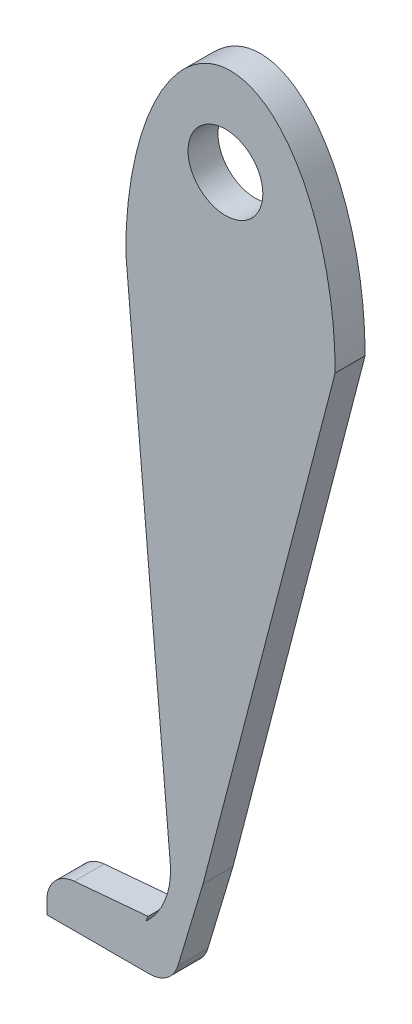
ISO-10303-21;
HEADER;
FILE_DESCRIPTION(('STEP AP214'),'2;1');
FILE_NAME('part.step','',(''),(''),'','','');
FILE_SCHEMA(('AUTOMOTIVE_DESIGN { 1 0 10303 214 1 1 1 1 }'));
ENDSEC;
DATA;
#1=APPLICATION_CONTEXT('core data for automotive mechanical design processes');
#2=APPLICATION_PROTOCOL_DEFINITION('international standard','automotive_design',2000,#1);
#3=PRODUCT_CONTEXT('',#1,'mechanical');
#4=PRODUCT('Part','Part','',(#3));
#5=PRODUCT_RELATED_PRODUCT_CATEGORY('part','',(#4));
#6=PRODUCT_DEFINITION_FORMATION('','',#4);
#7=PRODUCT_DEFINITION_CONTEXT('part definition',#1,'design');
#8=PRODUCT_DEFINITION('design','',#6,#7);
#9=PRODUCT_DEFINITION_SHAPE('','',#8);
#10=(LENGTH_UNIT() NAMED_UNIT(*) SI_UNIT(.MILLI.,.METRE.));
#11=(NAMED_UNIT(*) PLANE_ANGLE_UNIT() SI_UNIT($,.RADIAN.));
#12=(NAMED_UNIT(*) SI_UNIT($,.STERADIAN.) SOLID_ANGLE_UNIT());
#13=UNCERTAINTY_MEASURE_WITH_UNIT(LENGTH_MEASURE(1.E-05),#10,'distance_accuracy_value','');
#14=(GEOMETRIC_REPRESENTATION_CONTEXT(3) GLOBAL_UNCERTAINTY_ASSIGNED_CONTEXT((#13)) GLOBAL_UNIT_ASSIGNED_CONTEXT((#10,
#11,#12)) REPRESENTATION_CONTEXT('',''));
#15=CARTESIAN_POINT('',(0.,0.,0.));
#16=DIRECTION('',(0.,0.,1.));
#17=DIRECTION('',(1.,0.,0.));
#18=AXIS2_PLACEMENT_3D('',#15,#16,#17);
#19=CARTESIAN_POINT('',(-2.6062895464308,-7.,2.));
#20=DIRECTION('',(-0.957589152564701,0.288137145974652,0.));
#21=DIRECTION('',(-0.288137145974652,-0.957589152564701,0.));
#22=AXIS2_PLACEMENT_3D('',#19,#20,#21);
#23=PLANE('',#22);
#24=DIRECTION('',(0.288137145974652,0.957589152564701,0.));
#25=VECTOR('',#24,1.);
#26=CARTESIAN_POINT('',(-2.6062895464308,-7.,2.));
#27=LINE('',#26,#25);
#28=CARTESIAN_POINT('',(-2.17789260702337,-5.5762742919493,2.));
#29=VERTEX_POINT('',#28);
#30=CARTESIAN_POINT('',(-0.499999999999995,0.,2.));
#31=VERTEX_POINT('',#30);
#32=EDGE_CURVE('E154',#29,#31,#27,.T.);
#33=ORIENTED_EDGE('',*,*,#32,.F.);
#34=DIRECTION('',(0.,0.,-1.));
#35=VECTOR('',#34,1.);
#36=CARTESIAN_POINT('',(-2.17789260702337,-5.5762742919493,2.));
#37=LINE('',#36,#35);
#38=CARTESIAN_POINT('',(-2.17789260702337,-5.5762742919493,0.));
#39=VERTEX_POINT('',#38);
#40=EDGE_CURVE('E177',#29,#39,#37,.T.);
#41=ORIENTED_EDGE('',*,*,#40,.T.);
#42=DIRECTION('',(0.288137145974652,0.957589152564701,0.));
#43=VECTOR('',#42,1.);
#44=CARTESIAN_POINT('',(-2.6062895464308,-7.,0.));
#45=LINE('',#44,#43);
#46=CARTESIAN_POINT('',(-0.499999999999995,0.,0.));
#47=VERTEX_POINT('',#46);
#48=EDGE_CURVE('E197',#39,#47,#45,.T.);
#49=ORIENTED_EDGE('',*,*,#48,.T.);
#50=DIRECTION('',(0.,0.,-1.));
#51=VECTOR('',#50,1.);
#52=CARTESIAN_POINT('',(-0.499999999999995,0.,2.));
#53=LINE('',#52,#51);
#54=EDGE_CURVE('E165',#31,#47,#53,.T.);
#55=ORIENTED_EDGE('',*,*,#54,.F.);
#56=EDGE_LOOP('',(#33,#41,#49,#55));
#57=FACE_BOUND('',#56,.T.);
#58=ADVANCED_FACE('F34',(#57),#23,.F.);
#59=CARTESIAN_POINT('',(-0.499999999999995,0.,2.));
#60=DIRECTION('',(-0.96784691213223,0.251539966359438,0.));
#61=DIRECTION('',(-0.251539966359438,-0.96784691213223,0.));
#62=AXIS2_PLACEMENT_3D('',#59,#60,#61);
#63=PLANE('',#62);
#64=DIRECTION('',(0.251539966359438,0.96784691213223,0.));
#65=VECTOR('',#64,1.);
#66=CARTESIAN_POINT('',(-0.499999999999995,0.,0.));
#67=LINE('',#66,#65);
#68=CARTESIAN_POINT('',(8.33647894002109,34.,0.));
#69=VERTEX_POINT('',#68);
#70=EDGE_CURVE('E147',#47,#69,#67,.T.);
#71=ORIENTED_EDGE('',*,*,#70,.T.);
#72=DIRECTION('',(0.,0.,-1.));
#73=VECTOR('',#72,1.);
#74=CARTESIAN_POINT('',(8.33647894002109,34.,2.));
#75=LINE('',#74,#73);
#76=CARTESIAN_POINT('',(8.33647894002109,34.,2.));
#77=VERTEX_POINT('',#76);
#78=EDGE_CURVE('E162',#77,#69,#75,.T.);
#79=ORIENTED_EDGE('',*,*,#78,.F.);
#80=DIRECTION('',(0.251539966359438,0.96784691213223,0.));
#81=VECTOR('',#80,1.);
#82=CARTESIAN_POINT('',(-0.499999999999995,0.,2.));
#83=LINE('',#82,#81);
#84=EDGE_CURVE('E192',#31,#77,#83,.T.);
#85=ORIENTED_EDGE('',*,*,#84,.F.);
#86=ORIENTED_EDGE('',*,*,#54,.T.);
#87=EDGE_LOOP('',(#71,#79,#85,#86));
#88=FACE_BOUND('',#87,.T.);
#89=ADVANCED_FACE('F225',(#88),#63,.F.);
#90=CARTESIAN_POINT('',(1.33647894002109,34.,2.));
#91=DIRECTION('',(0.,0.,1.));
#92=DIRECTION('',(0.,1.,0.));
#93=AXIS2_PLACEMENT_3D('',#90,#91,#92);
#94=ELLIPSE('',#93,14.,7.);
#95=DIRECTION('',(0.,0.,-1.));
#96=VECTOR('',#95,1.);
#97=SURFACE_OF_LINEAR_EXTRUSION('',#94,#96);
#98=CARTESIAN_POINT('',(1.33647894002109,34.,0.));
#99=DIRECTION('',(0.,0.,1.));
#100=DIRECTION('',(0.,1.,0.));
#101=AXIS2_PLACEMENT_3D('',#98,#99,#100);
#102=ELLIPSE('',#101,14.,7.);
#103=CARTESIAN_POINT('',(-5.66352105997892,34.,0.));
#104=VERTEX_POINT('',#103);
#105=EDGE_CURVE('E142',#69,#104,#102,.T.);
#106=ORIENTED_EDGE('',*,*,#105,.T.);
#107=DIRECTION('',(0.,0.,-1.));
#108=VECTOR('',#107,1.);
#109=CARTESIAN_POINT('',(-5.66352105997892,34.,2.));
#110=LINE('',#109,#108);
#111=CARTESIAN_POINT('',(-5.66352105997892,34.,2.));
#112=VERTEX_POINT('',#111);
#113=EDGE_CURVE('E126',#112,#104,#110,.T.);
#114=ORIENTED_EDGE('',*,*,#113,.F.);
#115=EDGE_CURVE('E218',#77,#112,#94,.T.);
#116=ORIENTED_EDGE('',*,*,#115,.F.);
#117=ORIENTED_EDGE('',*,*,#78,.T.);
#118=EDGE_LOOP('',(#106,#114,#116,#117));
#119=FACE_BOUND('',#118,.T.);
#120=ADVANCED_FACE('F228',(#119),#97,.F.);
#121=CARTESIAN_POINT('',(-5.66352105997892,34.,2.));
#122=DIRECTION('',(0.99617267736109,0.0874070756817692,0.));
#123=DIRECTION('',(-0.0874070756817692,0.99617267736109,0.));
#124=AXIS2_PLACEMENT_3D('',#121,#122,#123);
#125=PLANE('',#124);
#126=DIRECTION('',(0.0874070756817692,-0.99617267736109,0.));
#127=VECTOR('',#126,1.);
#128=CARTESIAN_POINT('',(-5.66352105997892,34.,0.));
#129=LINE('',#128,#127);
#130=CARTESIAN_POINT('',(-2.68026259413472,0.,0.));
#131=VERTEX_POINT('',#130);
#132=EDGE_CURVE('E133',#104,#131,#129,.T.);
#133=ORIENTED_EDGE('',*,*,#132,.T.);
#134=DIRECTION('',(0.,0.,-1.));
#135=VECTOR('',#134,1.);
#136=CARTESIAN_POINT('',(-2.68026259413472,0.,2.));
#137=LINE('',#136,#135);
#138=CARTESIAN_POINT('',(-2.68026259413472,0.,2.));
#139=VERTEX_POINT('',#138);
#140=EDGE_CURVE('E118',#139,#131,#137,.T.);
#141=ORIENTED_EDGE('',*,*,#140,.F.);
#142=DIRECTION('',(0.0874070756817692,-0.99617267736109,0.));
#143=VECTOR('',#142,1.);
#144=CARTESIAN_POINT('',(-5.66352105997892,34.,2.));
#145=LINE('',#144,#143);
#146=EDGE_CURVE('E215',#112,#139,#145,.T.);
#147=ORIENTED_EDGE('',*,*,#146,.F.);
#148=ORIENTED_EDGE('',*,*,#113,.T.);
#149=EDGE_LOOP('',(#133,#141,#147,#148));
#150=FACE_BOUND('',#149,.T.);
#151=ADVANCED_FACE('F139',(#150),#125,.F.);
#152=CARTESIAN_POINT('',(-4.17189182705681,-3.70838700827068,2.));
#153=DIRECTION('',(0.0874070756817693,-0.996172677361089,0.));
#154=DIRECTION('',(0.99617267736109,0.0874070756817693,0.));
#155=AXIS2_PLACEMENT_3D('',#152,#153,#154);
#156=PLANE('',#155);
#157=DIRECTION('',(-0.99617267736109,-0.0874070756817693,0.));
#158=VECTOR('',#157,1.);
#159=CARTESIAN_POINT('',(-4.17189182705681,-3.70838700827068,0.));
#160=LINE('',#159,#158);
#161=CARTESIAN_POINT('',(-4.17189182705682,-3.70838700827069,0.));
#162=VERTEX_POINT('',#161);
#163=CARTESIAN_POINT('',(-9.11009276858463,-4.14167906017811,0.));
#164=VERTEX_POINT('',#163);
#165=EDGE_CURVE('E141',#162,#164,#160,.T.);
#166=ORIENTED_EDGE('',*,*,#165,.T.);
#167=DIRECTION('',(0.,0.,-1.));
#168=VECTOR('',#167,1.);
#169=CARTESIAN_POINT('',(-9.11009276858463,-4.14167906017811,2.));
#170=LINE('',#169,#168);
#171=CARTESIAN_POINT('',(-9.11009276858463,-4.14167906017811,2.));
#172=VERTEX_POINT('',#171);
#173=EDGE_CURVE('E173',#164,#172,#170,.F.);
#174=ORIENTED_EDGE('',*,*,#173,.T.);
#175=DIRECTION('',(-0.99617267736109,-0.0874070756817693,0.));
#176=VECTOR('',#175,1.);
#177=CARTESIAN_POINT('',(-4.17189182705681,-3.70838700827068,2.));
#178=LINE('',#177,#176);
#179=CARTESIAN_POINT('',(-4.17189182705682,-3.70838700827069,2.));
#180=VERTEX_POINT('',#179);
#181=EDGE_CURVE('E214',#180,#172,#178,.T.);
#182=ORIENTED_EDGE('',*,*,#181,.F.);
#183=DIRECTION('',(0.,0.,-1.));
#184=VECTOR('',#183,1.);
#185=CARTESIAN_POINT('',(-4.17189182705681,-3.70838700827068,2.));
#186=LINE('',#185,#184);
#187=EDGE_CURVE('E127',#180,#162,#186,.T.);
#188=ORIENTED_EDGE('',*,*,#187,.T.);
#189=EDGE_LOOP('',(#166,#174,#182,#188));
#190=FACE_BOUND('',#189,.T.);
#191=ADVANCED_FACE('F208',(#190),#156,.F.);
#192=CARTESIAN_POINT('',(-10.9352786172211,-4.30182615237469,2.));
#193=DIRECTION('',(1.,0.,0.));
#194=DIRECTION('',(0.,1.,0.));
#195=AXIS2_PLACEMENT_3D('',#192,#193,#194);
#196=PLANE('',#195);
#197=DIRECTION('',(0.,-1.,0.));
#198=VECTOR('',#197,1.);
#199=CARTESIAN_POINT('',(-10.9352786172211,-4.30182615237469,2.));
#200=LINE('',#199,#198);
#201=CARTESIAN_POINT('',(-10.9352786172211,-6.13402441490029,2.));
#202=VERTEX_POINT('',#201);
#203=CARTESIAN_POINT('',(-10.9352786172211,-7.,2.));
#204=VERTEX_POINT('',#203);
#205=EDGE_CURVE('E203',#202,#204,#200,.T.);
#206=ORIENTED_EDGE('',*,*,#205,.F.);
#207=DIRECTION('',(0.,0.,-1.));
#208=VECTOR('',#207,1.);
#209=CARTESIAN_POINT('',(-10.9352786172211,-6.13402441490029,2.));
#210=LINE('',#209,#208);
#211=CARTESIAN_POINT('',(-10.9352786172211,-6.13402441490029,0.));
#212=VERTEX_POINT('',#211);
#213=EDGE_CURVE('E168',#202,#212,#210,.T.);
#214=ORIENTED_EDGE('',*,*,#213,.T.);
#215=DIRECTION('',(0.,-1.,0.));
#216=VECTOR('',#215,1.);
#217=CARTESIAN_POINT('',(-10.9352786172211,-4.30182615237469,0.));
#218=LINE('',#217,#216);
#219=CARTESIAN_POINT('',(-10.9352786172211,-7.,0.));
#220=VERTEX_POINT('',#219);
#221=EDGE_CURVE('E145',#212,#220,#218,.T.);
#222=ORIENTED_EDGE('',*,*,#221,.T.);
#223=DIRECTION('',(0.,0.,-1.));
#224=VECTOR('',#223,1.);
#225=CARTESIAN_POINT('',(-10.9352786172211,-7.,2.));
#226=LINE('',#225,#224);
#227=EDGE_CURVE('E155',#204,#220,#226,.T.);
#228=ORIENTED_EDGE('',*,*,#227,.F.);
#229=EDGE_LOOP('',(#206,#214,#222,#228));
#230=FACE_BOUND('',#229,.T.);
#231=ADVANCED_FACE('F202',(#230),#196,.F.);
#232=CARTESIAN_POINT('',(-10.9352786172211,-7.,2.));
#233=DIRECTION('',(0.,1.,0.));
#234=DIRECTION('',(0.,0.,1.));
#235=AXIS2_PLACEMENT_3D('',#232,#233,#234);
#236=PLANE('',#235);
#237=DIRECTION('',(1.,0.,0.));
#238=VECTOR('',#237,1.);
#239=CARTESIAN_POINT('',(-10.9352786172211,-7.,0.));
#240=LINE('',#239,#238);
#241=CARTESIAN_POINT('',(-4.09307091215278,-7.,0.));
#242=VERTEX_POINT('',#241);
#243=EDGE_CURVE('E152',#220,#242,#240,.T.);
#244=ORIENTED_EDGE('',*,*,#243,.T.);
#245=DIRECTION('',(0.,0.,-1.));
#246=VECTOR('',#245,1.);
#247=CARTESIAN_POINT('',(-4.09307091215278,-7.,2.));
#248=LINE('',#247,#246);
#249=CARTESIAN_POINT('',(-4.09307091215278,-7.,2.));
#250=VERTEX_POINT('',#249);
#251=EDGE_CURVE('E57',#242,#250,#248,.F.);
#252=ORIENTED_EDGE('',*,*,#251,.T.);
#253=DIRECTION('',(1.,0.,0.));
#254=VECTOR('',#253,1.);
#255=CARTESIAN_POINT('',(-10.9352786172211,-7.,2.));
#256=LINE('',#255,#254);
#257=EDGE_CURVE('E158',#204,#250,#256,.T.);
#258=ORIENTED_EDGE('',*,*,#257,.F.);
#259=ORIENTED_EDGE('',*,*,#227,.T.);
#260=EDGE_LOOP('',(#244,#252,#258,#259));
#261=FACE_BOUND('',#260,.T.);
#262=ADVANCED_FACE('F198',(#261),#236,.F.);
#263=CARTESIAN_POINT('',(1.33647894002109,34.,2.));
#264=DIRECTION('',(0.,0.,1.));
#265=DIRECTION('',(1.,0.,0.));
#266=AXIS2_PLACEMENT_3D('',#263,#264,#265);
#267=PLANE('',#266);
#268=CARTESIAN_POINT('',(1.,41.95,2.));
#269=DIRECTION('',(0.,0.,1.));
#270=DIRECTION('',(1.,0.,0.));
#271=AXIS2_PLACEMENT_3D('',#268,#269,#270);
#272=CIRCLE('',#271,2.5);
#273=CARTESIAN_POINT('',(3.5,41.95,2.));
#274=VERTEX_POINT('',#273);
#275=EDGE_CURVE('E339',#274,#274,#272,.T.);
#276=ORIENTED_EDGE('',*,*,#275,.F.);
#277=EDGE_LOOP('',(#276));
#278=FACE_BOUND('',#277,.T.);
#279=CARTESIAN_POINT('',(-7.77918868173585,-0.304351605123055,2.));
#280=DIRECTION('',(0.,0.,1.));
#281=DIRECTION('',(-1.,0.,0.));
#282=AXIS2_PLACEMENT_3D('',#279,#280,#281);
#283=CIRCLE('',#282,5.10800128684012);
#284=CARTESIAN_POINT('',(-4.31115109931377,-4.05460392640337,2.));
#285=VERTEX_POINT('',#284);
#286=EDGE_CURVE('E121',#285,#139,#283,.T.);
#287=ORIENTED_EDGE('',*,*,#286,.F.);
#288=DIRECTION('',(-0.373174550583341,-0.927761151804128,0.));
#289=VECTOR('',#288,1.);
#290=CARTESIAN_POINT('',(-2.68026259413472,0.,2.));
#291=LINE('',#290,#289);
#292=EDGE_CURVE('E136',#180,#285,#291,.T.);
#293=ORIENTED_EDGE('',*,*,#292,.F.);
#294=ORIENTED_EDGE('',*,*,#181,.T.);
#295=CARTESIAN_POINT('',(-8.93527861722109,-6.13402441490029,2.));
#296=DIRECTION('',(0.,0.,1.));
#297=DIRECTION('',(1.,0.,0.));
#298=AXIS2_PLACEMENT_3D('',#295,#296,#297);
#299=CIRCLE('',#298,2.);
#300=EDGE_CURVE('E175',#172,#202,#299,.T.);
#301=ORIENTED_EDGE('',*,*,#300,.T.);
#302=ORIENTED_EDGE('',*,*,#205,.T.);
#303=ORIENTED_EDGE('',*,*,#257,.T.);
#304=CARTESIAN_POINT('',(-4.09307091215278,-5.,2.));
#305=DIRECTION('',(0.,0.,1.));
#306=DIRECTION('',(1.,0.,0.));
#307=AXIS2_PLACEMENT_3D('',#304,#305,#306);
#308=CIRCLE('',#307,2.);
#309=EDGE_CURVE('E42',#250,#29,#308,.T.);
#310=ORIENTED_EDGE('',*,*,#309,.T.);
#311=ORIENTED_EDGE('',*,*,#32,.T.);
#312=ORIENTED_EDGE('',*,*,#84,.T.);
#313=ORIENTED_EDGE('',*,*,#115,.T.);
#314=ORIENTED_EDGE('',*,*,#146,.T.);
#315=EDGE_LOOP('',(#287,#293,#294,#301,#302,#303,#310,#311,#312,#313,#314));
#316=FACE_BOUND('',#315,.T.);
#317=ADVANCED_FACE('F185',(#278,#316),#267,.T.);
#318=CARTESIAN_POINT('',(1.33647894002109,34.,0.));
#319=DIRECTION('',(0.,0.,1.));
#320=DIRECTION('',(1.,0.,0.));
#321=AXIS2_PLACEMENT_3D('',#318,#319,#320);
#322=PLANE('',#321);
#323=CARTESIAN_POINT('',(1.,41.95,0.));
#324=DIRECTION('',(0.,0.,1.));
#325=DIRECTION('',(1.,0.,0.));
#326=AXIS2_PLACEMENT_3D('',#323,#324,#325);
#327=CIRCLE('',#326,2.5);
#328=CARTESIAN_POINT('',(3.5,41.95,0.));
#329=VERTEX_POINT('',#328);
#330=EDGE_CURVE('E336',#329,#329,#327,.T.);
#331=ORIENTED_EDGE('',*,*,#330,.T.);
#332=EDGE_LOOP('',(#331));
#333=FACE_BOUND('',#332,.T.);
#334=DIRECTION('',(-0.373174550583341,-0.927761151804128,0.));
#335=VECTOR('',#334,1.);
#336=CARTESIAN_POINT('',(9.65047872977607,30.6558492678223,0.));
#337=LINE('',#336,#335);
#338=CARTESIAN_POINT('',(-4.31115109931377,-4.05460392640337,0.));
#339=VERTEX_POINT('',#338);
#340=EDGE_CURVE('E11',#162,#339,#337,.T.);
#341=ORIENTED_EDGE('',*,*,#340,.T.);
#342=CARTESIAN_POINT('',(-7.77918868173585,-0.304351605123055,0.));
#343=DIRECTION('',(0.,0.,1.));
#344=DIRECTION('',(-1.,0.,0.));
#345=AXIS2_PLACEMENT_3D('',#342,#343,#344);
#346=CIRCLE('',#345,5.10800128684012);
#347=EDGE_CURVE('E49',#339,#131,#346,.T.);
#348=ORIENTED_EDGE('',*,*,#347,.T.);
#349=ORIENTED_EDGE('',*,*,#132,.F.);
#350=ORIENTED_EDGE('',*,*,#105,.F.);
#351=ORIENTED_EDGE('',*,*,#70,.F.);
#352=ORIENTED_EDGE('',*,*,#48,.F.);
#353=CARTESIAN_POINT('',(-4.09307091215278,-5.,0.));
#354=DIRECTION('',(0.,0.,1.));
#355=DIRECTION('',(1.,0.,0.));
#356=AXIS2_PLACEMENT_3D('',#353,#354,#355);
#357=CIRCLE('',#356,2.);
#358=EDGE_CURVE('E180',#39,#242,#357,.F.);
#359=ORIENTED_EDGE('',*,*,#358,.T.);
#360=ORIENTED_EDGE('',*,*,#243,.F.);
#361=ORIENTED_EDGE('',*,*,#221,.F.);
#362=CARTESIAN_POINT('',(-8.93527861722109,-6.13402441490029,0.));
#363=DIRECTION('',(0.,0.,1.));
#364=DIRECTION('',(1.,0.,0.));
#365=AXIS2_PLACEMENT_3D('',#362,#363,#364);
#366=CIRCLE('',#365,2.);
#367=EDGE_CURVE('E171',#212,#164,#366,.F.);
#368=ORIENTED_EDGE('',*,*,#367,.T.);
#369=ORIENTED_EDGE('',*,*,#165,.F.);
#370=EDGE_LOOP('',(#341,#348,#349,#350,#351,#352,#359,#360,#361,#368,#369));
#371=FACE_BOUND('',#370,.T.);
#372=ADVANCED_FACE('F131',(#333,#371),#322,.F.);
#373=CARTESIAN_POINT('',(-8.93527861722109,-6.13402441490029,2.));
#374=DIRECTION('',(0.,0.,-1.));
#375=DIRECTION('',(-1.,0.,0.));
#376=AXIS2_PLACEMENT_3D('',#373,#374,#375);
#377=CYLINDRICAL_SURFACE('',#376,2.);
#378=ORIENTED_EDGE('',*,*,#300,.F.);
#379=ORIENTED_EDGE('',*,*,#173,.F.);
#380=ORIENTED_EDGE('',*,*,#367,.F.);
#381=ORIENTED_EDGE('',*,*,#213,.F.);
#382=EDGE_LOOP('',(#378,#379,#380,#381));
#383=FACE_BOUND('',#382,.T.);
#384=ADVANCED_FACE('F212',(#383),#377,.T.);
#385=CARTESIAN_POINT('',(-4.09307091215278,-5.,2.));
#386=DIRECTION('',(0.,0.,-1.));
#387=DIRECTION('',(-1.,0.,0.));
#388=AXIS2_PLACEMENT_3D('',#385,#386,#387);
#389=CYLINDRICAL_SURFACE('',#388,2.);
#390=ORIENTED_EDGE('',*,*,#309,.F.);
#391=ORIENTED_EDGE('',*,*,#251,.F.);
#392=ORIENTED_EDGE('',*,*,#358,.F.);
#393=ORIENTED_EDGE('',*,*,#40,.F.);
#394=EDGE_LOOP('',(#390,#391,#392,#393));
#395=FACE_BOUND('',#394,.T.);
#396=ADVANCED_FACE('F36',(#395),#389,.T.);
#397=CARTESIAN_POINT('',(-2.68026259413472,0.,0.));
#398=DIRECTION('',(-0.927761151804128,0.373174550583341,0.));
#399=DIRECTION('',(-0.373174550583341,-0.927761151804128,0.));
#400=AXIS2_PLACEMENT_3D('',#397,#398,#399);
#401=PLANE('',#400);
#402=ORIENTED_EDGE('',*,*,#292,.T.);
#403=DIRECTION('',(0.,0.,1.));
#404=VECTOR('',#403,1.);
#405=CARTESIAN_POINT('',(-4.31115109931377,-4.05460392640337,0.));
#406=LINE('',#405,#404);
#407=EDGE_CURVE('E135',#339,#285,#406,.T.);
#408=ORIENTED_EDGE('',*,*,#407,.F.);
#409=ORIENTED_EDGE('',*,*,#340,.F.);
#410=ORIENTED_EDGE('',*,*,#187,.F.);
#411=EDGE_LOOP('',(#402,#408,#409,#410));
#412=FACE_BOUND('',#411,.T.);
#413=ADVANCED_FACE('F244',(#412),#401,.F.);
#414=CARTESIAN_POINT('',(-7.77918868173585,-0.304351605123055,0.));
#415=DIRECTION('',(0.,0.,1.));
#416=DIRECTION('',(1.,0.,0.));
#417=AXIS2_PLACEMENT_3D('',#414,#415,#416);
#418=CYLINDRICAL_SURFACE('',#417,5.10800128684012);
#419=ORIENTED_EDGE('',*,*,#286,.T.);
#420=ORIENTED_EDGE('',*,*,#140,.T.);
#421=ORIENTED_EDGE('',*,*,#347,.F.);
#422=ORIENTED_EDGE('',*,*,#407,.T.);
#423=EDGE_LOOP('',(#419,#420,#421,#422));
#424=FACE_BOUND('',#423,.T.);
#425=ADVANCED_FACE('F119',(#424),#418,.F.);
#426=CARTESIAN_POINT('',(1.,41.95,0.));
#427=DIRECTION('',(0.,0.,1.));
#428=DIRECTION('',(1.,0.,0.));
#429=AXIS2_PLACEMENT_3D('',#426,#427,#428);
#430=CYLINDRICAL_SURFACE('',#429,2.5);
#431=ORIENTED_EDGE('',*,*,#330,.F.);
#432=EDGE_LOOP('',(#431));
#433=FACE_BOUND('',#432,.T.);
#434=ORIENTED_EDGE('',*,*,#275,.T.);
#435=EDGE_LOOP('',(#434));
#436=FACE_BOUND('',#435,.T.);
#437=ADVANCED_FACE('F308',(#433,#436),#430,.F.);
#438=CLOSED_SHELL('',(#58,#89,#120,#151,#191,#231,#262,#317,#372,#384,#396,#413,#425,#437));
#439=MANIFOLD_SOLID_BREP('B2',#438);
#440=ADVANCED_BREP_SHAPE_REPRESENTATION('',(#18,#439),#14);
#441=SHAPE_DEFINITION_REPRESENTATION(#9,#440);
ENDSEC;
END-ISO-10303-21;
